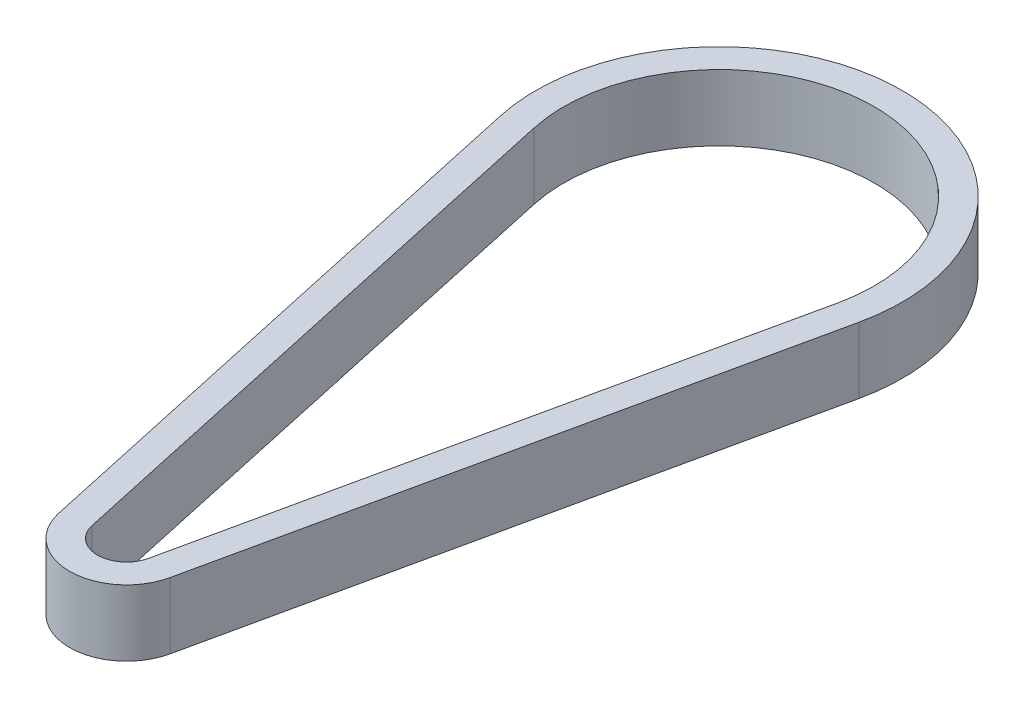
ISO-10303-21;
HEADER;
FILE_DESCRIPTION(('STEP AP214'),'2;1');
FILE_NAME('part.step','',(''),(''),'','','');
FILE_SCHEMA(('AUTOMOTIVE_DESIGN { 1 0 10303 214 1 1 1 1 }'));
ENDSEC;
DATA;
#1=APPLICATION_CONTEXT('core data for automotive mechanical design processes');
#2=APPLICATION_PROTOCOL_DEFINITION('international standard','automotive_design',2000,#1);
#3=PRODUCT_CONTEXT('',#1,'mechanical');
#4=PRODUCT('Part','Part','',(#3));
#5=PRODUCT_RELATED_PRODUCT_CATEGORY('part','',(#4));
#6=PRODUCT_DEFINITION_FORMATION('','',#4);
#7=PRODUCT_DEFINITION_CONTEXT('part definition',#1,'design');
#8=PRODUCT_DEFINITION('design','',#6,#7);
#9=PRODUCT_DEFINITION_SHAPE('','',#8);
#10=(LENGTH_UNIT() NAMED_UNIT(*) SI_UNIT(.MILLI.,.METRE.));
#11=(NAMED_UNIT(*) PLANE_ANGLE_UNIT() SI_UNIT($,.RADIAN.));
#12=(NAMED_UNIT(*) SI_UNIT($,.STERADIAN.) SOLID_ANGLE_UNIT());
#13=UNCERTAINTY_MEASURE_WITH_UNIT(LENGTH_MEASURE(1.E-05),#10,'distance_accuracy_value','');
#14=(GEOMETRIC_REPRESENTATION_CONTEXT(3) GLOBAL_UNCERTAINTY_ASSIGNED_CONTEXT((#13)) GLOBAL_UNIT_ASSIGNED_CONTEXT((#10,
#11,#12)) REPRESENTATION_CONTEXT('',''));
#15=CARTESIAN_POINT('',(0.,0.,0.));
#16=DIRECTION('',(0.,0.,1.));
#17=DIRECTION('',(1.,0.,0.));
#18=AXIS2_PLACEMENT_3D('',#15,#16,#17);
#19=CARTESIAN_POINT('',(0.,9.,80.6615391121929));
#20=DIRECTION('',(0.,1.,0.));
#21=DIRECTION('',(0.,0.,1.));
#22=AXIS2_PLACEMENT_3D('',#19,#20,#21);
#23=PLANE('',#22);
#24=CARTESIAN_POINT('',(0.,9.,80.6615391121929));
#25=DIRECTION('',(0.,1.,0.));
#26=DIRECTION('',(0.,0.,1.));
#27=AXIS2_PLACEMENT_3D('',#24,#25,#26);
#28=CIRCLE('',#27,7.76157795130823);
#29=CARTESIAN_POINT('',(-7.58330260034058,9.,82.3155082672565));
#30=VERTEX_POINT('',#29);
#31=CARTESIAN_POINT('',(7.58330260034057,9.,82.3155082672565));
#32=VERTEX_POINT('',#31);
#33=EDGE_CURVE('E133',#30,#32,#28,.T.);
#34=ORIENTED_EDGE('',*,*,#33,.T.);
#35=DIRECTION('',(0.213097022981631,0.,-0.977031042903124));
#36=VECTOR('',#35,1.);
#37=CARTESIAN_POINT('',(7.58330260034057,9.,82.3155082672565));
#38=LINE('',#37,#36);
#39=CARTESIAN_POINT('',(24.3772291638249,9.,5.31683716815858));
#40=VERTEX_POINT('',#39);
#41=EDGE_CURVE('E136',#32,#40,#38,.T.);
#42=ORIENTED_EDGE('',*,*,#41,.T.);
#43=CARTESIAN_POINT('',(0.,9.,0.));
#44=DIRECTION('',(0.,1.,0.));
#45=DIRECTION('',(0.,0.,1.));
#46=AXIS2_PLACEMENT_3D('',#43,#44,#45);
#47=CIRCLE('',#46,24.9503118052329);
#48=CARTESIAN_POINT('',(-24.3772291638249,9.,5.31683716815858));
#49=VERTEX_POINT('',#48);
#50=EDGE_CURVE('E139',#40,#49,#47,.T.);
#51=ORIENTED_EDGE('',*,*,#50,.T.);
#52=DIRECTION('',(0.213097022981631,0.,0.977031042903124));
#53=VECTOR('',#52,1.);
#54=CARTESIAN_POINT('',(-24.3772291638249,9.,5.31683716815858));
#55=LINE('',#54,#53);
#56=EDGE_CURVE('E141',#49,#30,#55,.T.);
#57=ORIENTED_EDGE('',*,*,#56,.T.);
#58=EDGE_LOOP('',(#34,#42,#51,#57));
#59=FACE_BOUND('',#58,.T.);
#60=DIRECTION('',(0.213097022981631,0.,-0.977031042903124));
#61=VECTOR('',#60,1.);
#62=CARTESIAN_POINT('',(3.86081432687967,9.,81.5036086096965));
#63=LINE('',#62,#61);
#64=CARTESIAN_POINT('',(3.86081432687967,9.,81.5036086096965));
#65=VERTEX_POINT('',#64);
#66=CARTESIAN_POINT('',(20.654740890364,9.,4.50493751059853));
#67=VERTEX_POINT('',#66);
#68=EDGE_CURVE('E105',#65,#67,#63,.T.);
#69=ORIENTED_EDGE('',*,*,#68,.F.);
#70=CARTESIAN_POINT('',(0.,9.,80.6615391121929));
#71=DIRECTION('',(0.,1.,0.));
#72=DIRECTION('',(0.,0.,1.));
#73=AXIS2_PLACEMENT_3D('',#70,#71,#72);
#74=CIRCLE('',#73,3.95157795130823);
#75=CARTESIAN_POINT('',(-3.86081432687967,9.,81.5036086096965));
#76=VERTEX_POINT('',#75);
#77=EDGE_CURVE('E97',#76,#65,#74,.T.);
#78=ORIENTED_EDGE('',*,*,#77,.F.);
#79=DIRECTION('',(0.213097022981631,0.,0.977031042903124));
#80=VECTOR('',#79,1.);
#81=CARTESIAN_POINT('',(-20.6547408903639,9.,4.50493751059858));
#82=LINE('',#81,#80);
#83=CARTESIAN_POINT('',(-20.6547408903639,9.,4.50493751059859));
#84=VERTEX_POINT('',#83);
#85=EDGE_CURVE('E119',#84,#76,#82,.T.);
#86=ORIENTED_EDGE('',*,*,#85,.F.);
#87=CARTESIAN_POINT('',(0.,9.,0.));
#88=DIRECTION('',(0.,1.,0.));
#89=DIRECTION('',(0.,0.,1.));
#90=AXIS2_PLACEMENT_3D('',#87,#88,#89);
#91=CIRCLE('',#90,21.1403118052329);
#92=EDGE_CURVE('E117',#67,#84,#91,.T.);
#93=ORIENTED_EDGE('',*,*,#92,.F.);
#94=EDGE_LOOP('',(#69,#78,#86,#93));
#95=FACE_BOUND('',#94,.T.);
#96=ADVANCED_FACE('F32',(#59,#95),#23,.T.);
#97=CARTESIAN_POINT('',(0.,0.,80.6615391121929));
#98=DIRECTION('',(0.,1.,0.));
#99=DIRECTION('',(0.,0.,1.));
#100=AXIS2_PLACEMENT_3D('',#97,#98,#99);
#101=PLANE('',#100);
#102=CARTESIAN_POINT('',(0.,0.,80.6615391121929));
#103=DIRECTION('',(0.,1.,0.));
#104=DIRECTION('',(0.,0.,1.));
#105=AXIS2_PLACEMENT_3D('',#102,#103,#104);
#106=CIRCLE('',#105,7.76157795130823);
#107=CARTESIAN_POINT('',(-7.58330260034058,0.,82.3155082672565));
#108=VERTEX_POINT('',#107);
#109=CARTESIAN_POINT('',(7.58330260034057,0.,82.3155082672565));
#110=VERTEX_POINT('',#109);
#111=EDGE_CURVE('E113',#108,#110,#106,.T.);
#112=ORIENTED_EDGE('',*,*,#111,.F.);
#113=DIRECTION('',(0.213097022981631,0.,0.977031042903124));
#114=VECTOR('',#113,1.);
#115=CARTESIAN_POINT('',(-24.3772291638249,0.,5.31683716815858));
#116=LINE('',#115,#114);
#117=CARTESIAN_POINT('',(-24.3772291638249,0.,5.31683716815858));
#118=VERTEX_POINT('',#117);
#119=EDGE_CURVE('E137',#118,#108,#116,.T.);
#120=ORIENTED_EDGE('',*,*,#119,.F.);
#121=CARTESIAN_POINT('',(0.,0.,0.));
#122=DIRECTION('',(0.,1.,0.));
#123=DIRECTION('',(0.,0.,1.));
#124=AXIS2_PLACEMENT_3D('',#121,#122,#123);
#125=CIRCLE('',#124,24.9503118052329);
#126=CARTESIAN_POINT('',(24.3772291638249,0.,5.31683716815858));
#127=VERTEX_POINT('',#126);
#128=EDGE_CURVE('E148',#127,#118,#125,.T.);
#129=ORIENTED_EDGE('',*,*,#128,.F.);
#130=DIRECTION('',(0.213097022981631,0.,-0.977031042903124));
#131=VECTOR('',#130,1.);
#132=CARTESIAN_POINT('',(7.58330260034057,0.,82.3155082672565));
#133=LINE('',#132,#131);
#134=EDGE_CURVE('E146',#110,#127,#133,.T.);
#135=ORIENTED_EDGE('',*,*,#134,.F.);
#136=EDGE_LOOP('',(#112,#120,#129,#135));
#137=FACE_BOUND('',#136,.T.);
#138=CARTESIAN_POINT('',(0.,0.,80.6615391121929));
#139=DIRECTION('',(0.,1.,0.));
#140=DIRECTION('',(0.,0.,1.));
#141=AXIS2_PLACEMENT_3D('',#138,#139,#140);
#142=CIRCLE('',#141,3.95157795130823);
#143=CARTESIAN_POINT('',(-3.86081432687967,0.,81.5036086096965));
#144=VERTEX_POINT('',#143);
#145=CARTESIAN_POINT('',(3.86081432687967,0.,81.5036086096965));
#146=VERTEX_POINT('',#145);
#147=EDGE_CURVE('E55',#144,#146,#142,.T.);
#148=ORIENTED_EDGE('',*,*,#147,.T.);
#149=DIRECTION('',(0.213097022981631,0.,-0.977031042903124));
#150=VECTOR('',#149,1.);
#151=CARTESIAN_POINT('',(3.86081432687967,0.,81.5036086096965));
#152=LINE('',#151,#150);
#153=CARTESIAN_POINT('',(20.654740890364,0.,4.50493751059853));
#154=VERTEX_POINT('',#153);
#155=EDGE_CURVE('E112',#146,#154,#152,.T.);
#156=ORIENTED_EDGE('',*,*,#155,.T.);
#157=CARTESIAN_POINT('',(0.,0.,0.));
#158=DIRECTION('',(0.,1.,0.));
#159=DIRECTION('',(0.,0.,1.));
#160=AXIS2_PLACEMENT_3D('',#157,#158,#159);
#161=CIRCLE('',#160,21.1403118052329);
#162=CARTESIAN_POINT('',(-20.6547408903639,0.,4.50493751059858));
#163=VERTEX_POINT('',#162);
#164=EDGE_CURVE('E125',#154,#163,#161,.T.);
#165=ORIENTED_EDGE('',*,*,#164,.T.);
#166=DIRECTION('',(0.213097022981631,0.,0.977031042903124));
#167=VECTOR('',#166,1.);
#168=CARTESIAN_POINT('',(-20.6547408903639,0.,4.50493751059858));
#169=LINE('',#168,#167);
#170=EDGE_CURVE('E106',#163,#144,#169,.T.);
#171=ORIENTED_EDGE('',*,*,#170,.T.);
#172=EDGE_LOOP('',(#148,#156,#165,#171));
#173=FACE_BOUND('',#172,.T.);
#174=ADVANCED_FACE('F166',(#137,#173),#101,.F.);
#175=CARTESIAN_POINT('',(0.,9.,80.6615391121929));
#176=DIRECTION('',(0.,-1.,0.));
#177=DIRECTION('',(0.,0.,-1.));
#178=AXIS2_PLACEMENT_3D('',#175,#176,#177);
#179=CYLINDRICAL_SURFACE('',#178,7.76157795130823);
#180=ORIENTED_EDGE('',*,*,#111,.T.);
#181=DIRECTION('',(0.,-1.,0.));
#182=VECTOR('',#181,1.);
#183=CARTESIAN_POINT('',(7.58330260034057,9.,82.3155082672565));
#184=LINE('',#183,#182);
#185=EDGE_CURVE('E11',#32,#110,#184,.T.);
#186=ORIENTED_EDGE('',*,*,#185,.F.);
#187=ORIENTED_EDGE('',*,*,#33,.F.);
#188=DIRECTION('',(0.,-1.,0.));
#189=VECTOR('',#188,1.);
#190=CARTESIAN_POINT('',(-7.58330260034058,9.,82.3155082672565));
#191=LINE('',#190,#189);
#192=EDGE_CURVE('E143',#30,#108,#191,.T.);
#193=ORIENTED_EDGE('',*,*,#192,.T.);
#194=EDGE_LOOP('',(#180,#186,#187,#193));
#195=FACE_BOUND('',#194,.T.);
#196=ADVANCED_FACE('F34',(#195),#179,.T.);
#197=CARTESIAN_POINT('',(7.58330260034057,9.,82.3155082672565));
#198=DIRECTION('',(-0.977031042903124,0.,-0.213097022981631));
#199=DIRECTION('',(-0.213097022981631,0.,0.977031042903124));
#200=AXIS2_PLACEMENT_3D('',#197,#198,#199);
#201=PLANE('',#200);
#202=ORIENTED_EDGE('',*,*,#134,.T.);
#203=DIRECTION('',(0.,-1.,0.));
#204=VECTOR('',#203,1.);
#205=CARTESIAN_POINT('',(24.3772291638249,9.,5.31683716815858));
#206=LINE('',#205,#204);
#207=EDGE_CURVE('E40',#40,#127,#206,.T.);
#208=ORIENTED_EDGE('',*,*,#207,.F.);
#209=ORIENTED_EDGE('',*,*,#41,.F.);
#210=ORIENTED_EDGE('',*,*,#185,.T.);
#211=EDGE_LOOP('',(#202,#208,#209,#210));
#212=FACE_BOUND('',#211,.T.);
#213=ADVANCED_FACE('F176',(#212),#201,.F.);
#214=CARTESIAN_POINT('',(0.,9.,0.));
#215=DIRECTION('',(0.,-1.,0.));
#216=DIRECTION('',(0.,0.,-1.));
#217=AXIS2_PLACEMENT_3D('',#214,#215,#216);
#218=CYLINDRICAL_SURFACE('',#217,24.9503118052329);
#219=ORIENTED_EDGE('',*,*,#128,.T.);
#220=DIRECTION('',(0.,-1.,0.));
#221=VECTOR('',#220,1.);
#222=CARTESIAN_POINT('',(-24.3772291638249,9.,5.31683716815858));
#223=LINE('',#222,#221);
#224=EDGE_CURVE('E153',#49,#118,#223,.T.);
#225=ORIENTED_EDGE('',*,*,#224,.F.);
#226=ORIENTED_EDGE('',*,*,#50,.F.);
#227=ORIENTED_EDGE('',*,*,#207,.T.);
#228=EDGE_LOOP('',(#219,#225,#226,#227));
#229=FACE_BOUND('',#228,.T.);
#230=ADVANCED_FACE('F160',(#229),#218,.T.);
#231=CARTESIAN_POINT('',(-24.3772291638249,9.,5.31683716815858));
#232=DIRECTION('',(0.977031042903124,0.,-0.213097022981631));
#233=DIRECTION('',(-0.213097022981631,0.,-0.977031042903124));
#234=AXIS2_PLACEMENT_3D('',#231,#232,#233);
#235=PLANE('',#234);
#236=ORIENTED_EDGE('',*,*,#119,.T.);
#237=ORIENTED_EDGE('',*,*,#192,.F.);
#238=ORIENTED_EDGE('',*,*,#56,.F.);
#239=ORIENTED_EDGE('',*,*,#224,.T.);
#240=EDGE_LOOP('',(#236,#237,#238,#239));
#241=FACE_BOUND('',#240,.T.);
#242=ADVANCED_FACE('F170',(#241),#235,.F.);
#243=CARTESIAN_POINT('',(0.,9.,80.6615391121929));
#244=DIRECTION('',(0.,-1.,0.));
#245=DIRECTION('',(0.,0.,-1.));
#246=AXIS2_PLACEMENT_3D('',#243,#244,#245);
#247=CYLINDRICAL_SURFACE('',#246,3.95157795130823);
#248=ORIENTED_EDGE('',*,*,#147,.F.);
#249=DIRECTION('',(0.,-1.,0.));
#250=VECTOR('',#249,1.);
#251=CARTESIAN_POINT('',(-3.86081432687967,9.,81.5036086096965));
#252=LINE('',#251,#250);
#253=EDGE_CURVE('E101',#76,#144,#252,.T.);
#254=ORIENTED_EDGE('',*,*,#253,.F.);
#255=ORIENTED_EDGE('',*,*,#77,.T.);
#256=DIRECTION('',(0.,-1.,0.));
#257=VECTOR('',#256,1.);
#258=CARTESIAN_POINT('',(3.86081432687967,9.,81.5036086096965));
#259=LINE('',#258,#257);
#260=EDGE_CURVE('E100',#65,#146,#259,.T.);
#261=ORIENTED_EDGE('',*,*,#260,.T.);
#262=EDGE_LOOP('',(#248,#254,#255,#261));
#263=FACE_BOUND('',#262,.T.);
#264=ADVANCED_FACE('F99',(#263),#247,.F.);
#265=CARTESIAN_POINT('',(3.86081432687967,9.,81.5036086096965));
#266=DIRECTION('',(-0.977031042903124,0.,-0.213097022981631));
#267=DIRECTION('',(-0.213097022981631,0.,0.977031042903124));
#268=AXIS2_PLACEMENT_3D('',#265,#266,#267);
#269=PLANE('',#268);
#270=ORIENTED_EDGE('',*,*,#155,.F.);
#271=ORIENTED_EDGE('',*,*,#260,.F.);
#272=ORIENTED_EDGE('',*,*,#68,.T.);
#273=DIRECTION('',(0.,-1.,0.));
#274=VECTOR('',#273,1.);
#275=CARTESIAN_POINT('',(20.654740890364,9.,4.50493751059853));
#276=LINE('',#275,#274);
#277=EDGE_CURVE('E114',#67,#154,#276,.T.);
#278=ORIENTED_EDGE('',*,*,#277,.T.);
#279=EDGE_LOOP('',(#270,#271,#272,#278));
#280=FACE_BOUND('',#279,.T.);
#281=ADVANCED_FACE('F109',(#280),#269,.T.);
#282=CARTESIAN_POINT('',(0.,9.,0.));
#283=DIRECTION('',(0.,-1.,0.));
#284=DIRECTION('',(0.,0.,-1.));
#285=AXIS2_PLACEMENT_3D('',#282,#283,#284);
#286=CYLINDRICAL_SURFACE('',#285,21.1403118052329);
#287=ORIENTED_EDGE('',*,*,#164,.F.);
#288=ORIENTED_EDGE('',*,*,#277,.F.);
#289=ORIENTED_EDGE('',*,*,#92,.T.);
#290=DIRECTION('',(0.,-1.,0.));
#291=VECTOR('',#290,1.);
#292=CARTESIAN_POINT('',(-20.6547408903639,9.,4.50493751059858));
#293=LINE('',#292,#291);
#294=EDGE_CURVE('E47',#84,#163,#293,.T.);
#295=ORIENTED_EDGE('',*,*,#294,.T.);
#296=EDGE_LOOP('',(#287,#288,#289,#295));
#297=FACE_BOUND('',#296,.T.);
#298=ADVANCED_FACE('F199',(#297),#286,.F.);
#299=CARTESIAN_POINT('',(-20.6547408903639,9.,4.50493751059858));
#300=DIRECTION('',(0.977031042903124,0.,-0.213097022981631));
#301=DIRECTION('',(-0.213097022981631,0.,-0.977031042903124));
#302=AXIS2_PLACEMENT_3D('',#299,#300,#301);
#303=PLANE('',#302);
#304=ORIENTED_EDGE('',*,*,#170,.F.);
#305=ORIENTED_EDGE('',*,*,#294,.F.);
#306=ORIENTED_EDGE('',*,*,#85,.T.);
#307=ORIENTED_EDGE('',*,*,#253,.T.);
#308=EDGE_LOOP('',(#304,#305,#306,#307));
#309=FACE_BOUND('',#308,.T.);
#310=ADVANCED_FACE('F203',(#309),#303,.T.);
#311=CLOSED_SHELL('',(#96,#174,#196,#213,#230,#242,#264,#281,#298,#310));
#312=MANIFOLD_SOLID_BREP('B2',#311);
#313=ADVANCED_BREP_SHAPE_REPRESENTATION('',(#18,#312),#14);
#314=SHAPE_DEFINITION_REPRESENTATION(#9,#313);
ENDSEC;
END-ISO-10303-21;
